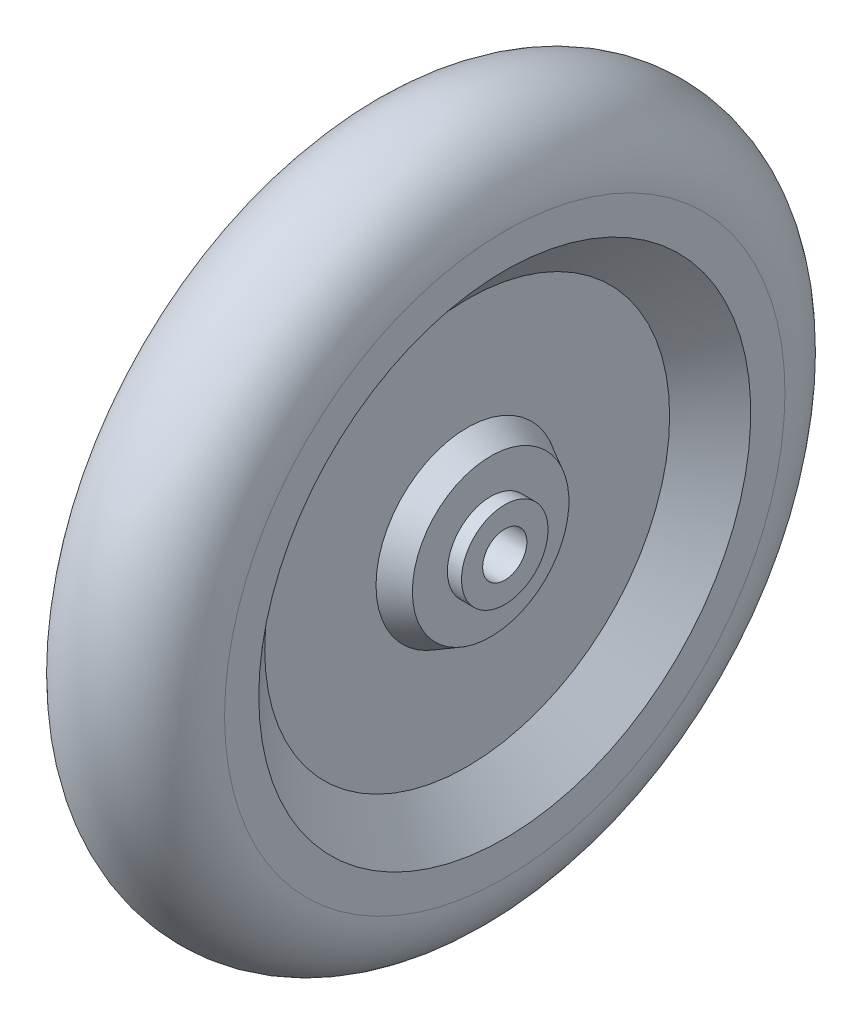
ISO-10303-21;
HEADER;
FILE_DESCRIPTION(('STEP AP214'),'2;1');
FILE_NAME('part.step','',(''),(''),'','','');
FILE_SCHEMA(('AUTOMOTIVE_DESIGN { 1 0 10303 214 1 1 1 1 }'));
ENDSEC;
DATA;
#1=APPLICATION_CONTEXT('core data for automotive mechanical design processes');
#2=APPLICATION_PROTOCOL_DEFINITION('international standard','automotive_design',2000,#1);
#3=PRODUCT_CONTEXT('',#1,'mechanical');
#4=PRODUCT('Part','Part','',(#3));
#5=PRODUCT_RELATED_PRODUCT_CATEGORY('part','',(#4));
#6=PRODUCT_DEFINITION_FORMATION('','',#4);
#7=PRODUCT_DEFINITION_CONTEXT('part definition',#1,'design');
#8=PRODUCT_DEFINITION('design','',#6,#7);
#9=PRODUCT_DEFINITION_SHAPE('','',#8);
#10=(LENGTH_UNIT() NAMED_UNIT(*) SI_UNIT(.MILLI.,.METRE.));
#11=(NAMED_UNIT(*) PLANE_ANGLE_UNIT() SI_UNIT($,.RADIAN.));
#12=(NAMED_UNIT(*) SI_UNIT($,.STERADIAN.) SOLID_ANGLE_UNIT());
#13=UNCERTAINTY_MEASURE_WITH_UNIT(LENGTH_MEASURE(1.E-05),#10,'distance_accuracy_value','');
#14=(GEOMETRIC_REPRESENTATION_CONTEXT(3) GLOBAL_UNCERTAINTY_ASSIGNED_CONTEXT((#13)) GLOBAL_UNIT_ASSIGNED_CONTEXT((#10,
#11,#12)) REPRESENTATION_CONTEXT('',''));
#15=CARTESIAN_POINT('',(0.,0.,0.));
#16=DIRECTION('',(0.,0.,1.));
#17=DIRECTION('',(1.,0.,0.));
#18=AXIS2_PLACEMENT_3D('',#15,#16,#17);
#19=CARTESIAN_POINT('',(-15.875,4.7625,0.));
#20=DIRECTION('',(1.,0.,0.));
#21=DIRECTION('',(0.,0.,-1.));
#22=AXIS2_PLACEMENT_3D('',#19,#20,#21);
#23=PLANE('',#22);
#24=CARTESIAN_POINT('',(-15.875,0.,0.));
#25=DIRECTION('',(-1.,0.,0.));
#26=DIRECTION('',(0.,0.,1.));
#27=AXIS2_PLACEMENT_3D('',#24,#25,#26);
#28=CIRCLE('',#27,4.7625);
#29=CARTESIAN_POINT('',(-15.875,0.,4.7625));
#30=VERTEX_POINT('',#29);
#31=EDGE_CURVE('E10',#30,#30,#28,.T.);
#32=ORIENTED_EDGE('',*,*,#31,.F.);
#33=EDGE_LOOP('',(#32));
#34=FACE_BOUND('',#33,.T.);
#35=CARTESIAN_POINT('',(-15.8750000000001,0.,0.));
#36=DIRECTION('',(-1.,0.,0.));
#37=DIRECTION('',(0.,0.,1.));
#38=AXIS2_PLACEMENT_3D('',#35,#36,#37);
#39=CIRCLE('',#38,9.31101513051158);
#40=CARTESIAN_POINT('',(-15.8750000000001,0.,9.31101513051158));
#41=VERTEX_POINT('',#40);
#42=EDGE_CURVE('E83',#41,#41,#39,.T.);
#43=ORIENTED_EDGE('',*,*,#42,.T.);
#44=EDGE_LOOP('',(#43));
#45=FACE_BOUND('',#44,.T.);
#46=ADVANCED_FACE('F31',(#34,#45),#23,.F.);
#47=CARTESIAN_POINT('',(-1000.,0.,0.));
#48=DIRECTION('',(-1.,0.,0.));
#49=DIRECTION('',(0.,0.,1.));
#50=AXIS2_PLACEMENT_3D('',#47,#48,#49);
#51=CYLINDRICAL_SURFACE('',#50,4.7625);
#52=CARTESIAN_POINT('',(15.8750000000001,0.,0.));
#53=DIRECTION('',(-1.,0.,0.));
#54=DIRECTION('',(0.,0.,1.));
#55=AXIS2_PLACEMENT_3D('',#52,#53,#54);
#56=CIRCLE('',#55,4.7625);
#57=CARTESIAN_POINT('',(15.8750000000001,0.,4.7625));
#58=VERTEX_POINT('',#57);
#59=EDGE_CURVE('E37',#58,#58,#56,.T.);
#60=ORIENTED_EDGE('',*,*,#59,.F.);
#61=EDGE_LOOP('',(#60));
#62=FACE_BOUND('',#61,.T.);
#63=ORIENTED_EDGE('',*,*,#31,.T.);
#64=EDGE_LOOP('',(#63));
#65=FACE_BOUND('',#64,.T.);
#66=ADVANCED_FACE('F168',(#62,#65),#51,.F.);
#67=CARTESIAN_POINT('',(15.875,4.7625,0.));
#68=DIRECTION('',(-1.,0.,0.));
#69=DIRECTION('',(0.,0.,1.));
#70=AXIS2_PLACEMENT_3D('',#67,#68,#69);
#71=PLANE('',#70);
#72=CARTESIAN_POINT('',(15.8750000000001,0.,0.));
#73=DIRECTION('',(-1.,0.,0.));
#74=DIRECTION('',(0.,0.,1.));
#75=AXIS2_PLACEMENT_3D('',#72,#73,#74);
#76=CIRCLE('',#75,9.31101513051158);
#77=CARTESIAN_POINT('',(15.8750000000001,0.,9.31101513051158));
#78=VERTEX_POINT('',#77);
#79=EDGE_CURVE('E41',#78,#78,#76,.T.);
#80=ORIENTED_EDGE('',*,*,#79,.F.);
#81=EDGE_LOOP('',(#80));
#82=FACE_BOUND('',#81,.T.);
#83=ORIENTED_EDGE('',*,*,#59,.T.);
#84=EDGE_LOOP('',(#83));
#85=FACE_BOUND('',#84,.T.);
#86=ADVANCED_FACE('F163',(#82,#85),#71,.F.);
#87=CARTESIAN_POINT('',(-1000.,0.,0.));
#88=DIRECTION('',(-1.,0.,0.));
#89=DIRECTION('',(0.,0.,1.));
#90=AXIS2_PLACEMENT_3D('',#87,#88,#89);
#91=CYLINDRICAL_SURFACE('',#90,9.31101513051158);
#92=CARTESIAN_POINT('',(12.8385031899303,0.,0.));
#93=DIRECTION('',(-1.,0.,0.));
#94=DIRECTION('',(0.,0.,1.));
#95=AXIS2_PLACEMENT_3D('',#92,#93,#94);
#96=CIRCLE('',#95,9.31101513051158);
#97=CARTESIAN_POINT('',(12.8385031899303,0.,9.31101513051158));
#98=VERTEX_POINT('',#97);
#99=EDGE_CURVE('E45',#98,#98,#96,.T.);
#100=ORIENTED_EDGE('',*,*,#99,.F.);
#101=EDGE_LOOP('',(#100));
#102=FACE_BOUND('',#101,.T.);
#103=ORIENTED_EDGE('',*,*,#79,.T.);
#104=EDGE_LOOP('',(#103));
#105=FACE_BOUND('',#104,.T.);
#106=ADVANCED_FACE('F157',(#102,#105),#91,.T.);
#107=CARTESIAN_POINT('',(12.8385031899302,9.31101513051158,0.));
#108=DIRECTION('',(-1.,0.,0.));
#109=DIRECTION('',(0.,0.,1.));
#110=AXIS2_PLACEMENT_3D('',#107,#108,#109);
#111=PLANE('',#110);
#112=CARTESIAN_POINT('',(12.8385031899303,0.,0.));
#113=DIRECTION('',(-1.,0.,0.));
#114=DIRECTION('',(0.,0.,1.));
#115=AXIS2_PLACEMENT_3D('',#112,#113,#114);
#116=CIRCLE('',#115,16.8508865092168);
#117=CARTESIAN_POINT('',(12.8385031899303,0.,16.8508865092168));
#118=VERTEX_POINT('',#117);
#119=EDGE_CURVE('E50',#118,#118,#116,.T.);
#120=ORIENTED_EDGE('',*,*,#119,.F.);
#121=EDGE_LOOP('',(#120));
#122=FACE_BOUND('',#121,.T.);
#123=ORIENTED_EDGE('',*,*,#99,.T.);
#124=EDGE_LOOP('',(#123));
#125=FACE_BOUND('',#124,.T.);
#126=ADVANCED_FACE('F151',(#122,#125),#111,.F.);
#127=CARTESIAN_POINT('',(12.8385031899303,0.,0.));
#128=DIRECTION('',(-1.,0.,0.));
#129=DIRECTION('',(0.,0.,1.));
#130=AXIS2_PLACEMENT_3D('',#127,#128,#129);
#131=CONICAL_SURFACE('',#130,16.8508865092168,0.501604054189691);
#132=CARTESIAN_POINT('',(7.78208729760599,0.,0.));
#133=DIRECTION('',(-1.,0.,0.));
#134=DIRECTION('',(0.,0.,1.));
#135=AXIS2_PLACEMENT_3D('',#132,#133,#134);
#136=CIRCLE('',#135,19.6237597404952);
#137=CARTESIAN_POINT('',(7.78208729760599,0.,19.6237597404952));
#138=VERTEX_POINT('',#137);
#139=EDGE_CURVE('E53',#138,#138,#136,.T.);
#140=ORIENTED_EDGE('',*,*,#139,.F.);
#141=EDGE_LOOP('',(#140));
#142=FACE_BOUND('',#141,.T.);
#143=ORIENTED_EDGE('',*,*,#119,.T.);
#144=EDGE_LOOP('',(#143));
#145=FACE_BOUND('',#144,.T.);
#146=ADVANCED_FACE('F145',(#142,#145),#131,.T.);
#147=CARTESIAN_POINT('',(7.78208729760609,43.5871976270477,0.));
#148=DIRECTION('',(-1.,0.,0.));
#149=DIRECTION('',(0.,0.,1.));
#150=AXIS2_PLACEMENT_3D('',#147,#148,#149);
#151=PLANE('',#150);
#152=CARTESIAN_POINT('',(7.78208729760599,0.,0.));
#153=DIRECTION('',(-1.,0.,0.));
#154=DIRECTION('',(0.,0.,1.));
#155=AXIS2_PLACEMENT_3D('',#152,#153,#154);
#156=CIRCLE('',#155,43.5871976270477);
#157=CARTESIAN_POINT('',(7.78208729760599,0.,43.5871976270477));
#158=VERTEX_POINT('',#157);
#159=EDGE_CURVE('E56',#158,#158,#156,.T.);
#160=ORIENTED_EDGE('',*,*,#159,.F.);
#161=EDGE_LOOP('',(#160));
#162=FACE_BOUND('',#161,.T.);
#163=ORIENTED_EDGE('',*,*,#139,.T.);
#164=EDGE_LOOP('',(#163));
#165=FACE_BOUND('',#164,.T.);
#166=ADVANCED_FACE('F139',(#162,#165),#151,.F.);
#167=CARTESIAN_POINT('',(7.78208729760599,0.,0.));
#168=DIRECTION('',(1.,0.,0.));
#169=DIRECTION('',(0.,0.,-1.));
#170=AXIS2_PLACEMENT_3D('',#167,#168,#169);
#171=CONICAL_SURFACE('',#170,43.5871976270477,0.858552168985071);
#172=CARTESIAN_POINT('',(15.875000000007,0.,0.));
#173=DIRECTION('',(-1.,0.,0.));
#174=DIRECTION('',(0.,0.,1.));
#175=AXIS2_PLACEMENT_3D('',#172,#173,#174);
#176=CIRCLE('',#175,52.9600878602281);
#177=CARTESIAN_POINT('',(15.875000000007,0.,52.9600878602281));
#178=VERTEX_POINT('',#177);
#179=EDGE_CURVE('E59',#178,#178,#176,.T.);
#180=ORIENTED_EDGE('',*,*,#179,.F.);
#181=EDGE_LOOP('',(#180));
#182=FACE_BOUND('',#181,.T.);
#183=ORIENTED_EDGE('',*,*,#159,.T.);
#184=EDGE_LOOP('',(#183));
#185=FACE_BOUND('',#184,.T.);
#186=ADVANCED_FACE('F133',(#182,#185),#171,.F.);
#187=CARTESIAN_POINT('',(15.8750000000035,52.9600878602281,0.));
#188=DIRECTION('',(-1.,0.,0.));
#189=DIRECTION('',(0.,0.,1.));
#190=AXIS2_PLACEMENT_3D('',#187,#188,#189);
#191=PLANE('',#190);
#192=CARTESIAN_POINT('',(15.8750000000001,0.,0.));
#193=DIRECTION('',(-1.,0.,0.));
#194=DIRECTION('',(0.,0.,1.));
#195=AXIS2_PLACEMENT_3D('',#192,#193,#194);
#196=CIRCLE('',#195,60.325);
#197=CARTESIAN_POINT('',(15.8750000000001,0.,60.325));
#198=VERTEX_POINT('',#197);
#199=EDGE_CURVE('E62',#198,#198,#196,.T.);
#200=ORIENTED_EDGE('',*,*,#199,.F.);
#201=EDGE_LOOP('',(#200));
#202=FACE_BOUND('',#201,.T.);
#203=ORIENTED_EDGE('',*,*,#179,.T.);
#204=EDGE_LOOP('',(#203));
#205=FACE_BOUND('',#204,.T.);
#206=ADVANCED_FACE('F127',(#202,#205),#191,.F.);
#207=CARTESIAN_POINT('',(0.,0.,0.));
#208=DIRECTION('',(-1.,0.,0.));
#209=DIRECTION('',(0.,0.,1.));
#210=AXIS2_PLACEMENT_3D('',#207,#208,#209);
#211=TOROIDAL_SURFACE('',#210,60.325,15.875);
#212=CARTESIAN_POINT('',(-15.875,0.,0.));
#213=DIRECTION('',(-1.,0.,0.));
#214=DIRECTION('',(0.,0.,1.));
#215=AXIS2_PLACEMENT_3D('',#212,#213,#214);
#216=CIRCLE('',#215,60.325);
#217=CARTESIAN_POINT('',(-15.875,0.,60.325));
#218=VERTEX_POINT('',#217);
#219=EDGE_CURVE('E65',#218,#218,#216,.T.);
#220=ORIENTED_EDGE('',*,*,#219,.F.);
#221=EDGE_LOOP('',(#220));
#222=FACE_BOUND('',#221,.T.);
#223=ORIENTED_EDGE('',*,*,#199,.T.);
#224=EDGE_LOOP('',(#223));
#225=FACE_BOUND('',#224,.T.);
#226=ADVANCED_FACE('F121',(#222,#225),#211,.T.);
#227=CARTESIAN_POINT('',(-15.875,52.9600878602281,0.));
#228=DIRECTION('',(1.,0.,0.));
#229=DIRECTION('',(0.,0.,-1.));
#230=AXIS2_PLACEMENT_3D('',#227,#228,#229);
#231=PLANE('',#230);
#232=CARTESIAN_POINT('',(-15.875,0.,0.));
#233=DIRECTION('',(-1.,0.,0.));
#234=DIRECTION('',(0.,0.,1.));
#235=AXIS2_PLACEMENT_3D('',#232,#233,#234);
#236=CIRCLE('',#235,52.9600878602281);
#237=CARTESIAN_POINT('',(-15.875,0.,52.9600878602281));
#238=VERTEX_POINT('',#237);
#239=EDGE_CURVE('E68',#238,#238,#236,.T.);
#240=ORIENTED_EDGE('',*,*,#239,.F.);
#241=EDGE_LOOP('',(#240));
#242=FACE_BOUND('',#241,.T.);
#243=ORIENTED_EDGE('',*,*,#219,.T.);
#244=EDGE_LOOP('',(#243));
#245=FACE_BOUND('',#244,.T.);
#246=ADVANCED_FACE('F115',(#242,#245),#231,.F.);
#247=CARTESIAN_POINT('',(-15.875,0.,0.));
#248=DIRECTION('',(-1.,0.,0.));
#249=DIRECTION('',(0.,0.,1.));
#250=AXIS2_PLACEMENT_3D('',#247,#248,#249);
#251=CONICAL_SURFACE('',#250,52.9600878602281,0.858552168985078);
#252=CARTESIAN_POINT('',(-7.78208729759911,0.,0.));
#253=DIRECTION('',(-1.,0.,0.));
#254=DIRECTION('',(0.,0.,1.));
#255=AXIS2_PLACEMENT_3D('',#252,#253,#254);
#256=CIRCLE('',#255,43.5871976270477);
#257=CARTESIAN_POINT('',(-7.78208729759911,0.,43.5871976270477));
#258=VERTEX_POINT('',#257);
#259=EDGE_CURVE('E71',#258,#258,#256,.T.);
#260=ORIENTED_EDGE('',*,*,#259,.F.);
#261=EDGE_LOOP('',(#260));
#262=FACE_BOUND('',#261,.T.);
#263=ORIENTED_EDGE('',*,*,#239,.T.);
#264=EDGE_LOOP('',(#263));
#265=FACE_BOUND('',#264,.T.);
#266=ADVANCED_FACE('F109',(#262,#265),#251,.F.);
#267=CARTESIAN_POINT('',(-7.78208729759911,43.5871976270477,0.));
#268=DIRECTION('',(1.,0.,0.));
#269=DIRECTION('',(0.,0.,-1.));
#270=AXIS2_PLACEMENT_3D('',#267,#268,#269);
#271=PLANE('',#270);
#272=CARTESIAN_POINT('',(-7.78208729759911,0.,0.));
#273=DIRECTION('',(-1.,0.,0.));
#274=DIRECTION('',(0.,0.,1.));
#275=AXIS2_PLACEMENT_3D('',#272,#273,#274);
#276=CIRCLE('',#275,19.6237597404952);
#277=CARTESIAN_POINT('',(-7.78208729759911,0.,19.6237597404952));
#278=VERTEX_POINT('',#277);
#279=EDGE_CURVE('E74',#278,#278,#276,.T.);
#280=ORIENTED_EDGE('',*,*,#279,.F.);
#281=EDGE_LOOP('',(#280));
#282=FACE_BOUND('',#281,.T.);
#283=ORIENTED_EDGE('',*,*,#259,.T.);
#284=EDGE_LOOP('',(#283));
#285=FACE_BOUND('',#284,.T.);
#286=ADVANCED_FACE('F103',(#282,#285),#271,.F.);
#287=CARTESIAN_POINT('',(-7.78208729759911,0.,0.));
#288=DIRECTION('',(1.,0.,0.));
#289=DIRECTION('',(0.,0.,-1.));
#290=AXIS2_PLACEMENT_3D('',#287,#288,#289);
#291=CONICAL_SURFACE('',#290,19.6237597404952,0.501604054189126);
#292=CARTESIAN_POINT('',(-12.8385031899302,0.,0.));
#293=DIRECTION('',(-1.,0.,0.));
#294=DIRECTION('',(0.,0.,1.));
#295=AXIS2_PLACEMENT_3D('',#292,#293,#294);
#296=CIRCLE('',#295,16.8508865092168);
#297=CARTESIAN_POINT('',(-12.8385031899302,0.,16.8508865092168));
#298=VERTEX_POINT('',#297);
#299=EDGE_CURVE('E77',#298,#298,#296,.T.);
#300=ORIENTED_EDGE('',*,*,#299,.F.);
#301=EDGE_LOOP('',(#300));
#302=FACE_BOUND('',#301,.T.);
#303=ORIENTED_EDGE('',*,*,#279,.T.);
#304=EDGE_LOOP('',(#303));
#305=FACE_BOUND('',#304,.T.);
#306=ADVANCED_FACE('F97',(#302,#305),#291,.T.);
#307=CARTESIAN_POINT('',(-12.8385031899302,9.31101513051158,0.));
#308=DIRECTION('',(1.,0.,0.));
#309=DIRECTION('',(0.,0.,-1.));
#310=AXIS2_PLACEMENT_3D('',#307,#308,#309);
#311=PLANE('',#310);
#312=CARTESIAN_POINT('',(-12.8385031899302,0.,0.));
#313=DIRECTION('',(-1.,0.,0.));
#314=DIRECTION('',(0.,0.,1.));
#315=AXIS2_PLACEMENT_3D('',#312,#313,#314);
#316=CIRCLE('',#315,9.31101513051158);
#317=CARTESIAN_POINT('',(-12.8385031899302,0.,9.31101513051158));
#318=VERTEX_POINT('',#317);
#319=EDGE_CURVE('E80',#318,#318,#316,.T.);
#320=ORIENTED_EDGE('',*,*,#319,.F.);
#321=EDGE_LOOP('',(#320));
#322=FACE_BOUND('',#321,.T.);
#323=ORIENTED_EDGE('',*,*,#299,.T.);
#324=EDGE_LOOP('',(#323));
#325=FACE_BOUND('',#324,.T.);
#326=ADVANCED_FACE('F91',(#322,#325),#311,.F.);
#327=CARTESIAN_POINT('',(-1000.,0.,0.));
#328=DIRECTION('',(-1.,0.,0.));
#329=DIRECTION('',(0.,0.,1.));
#330=AXIS2_PLACEMENT_3D('',#327,#328,#329);
#331=CYLINDRICAL_SURFACE('',#330,9.31101513051158);
#332=ORIENTED_EDGE('',*,*,#42,.F.);
#333=EDGE_LOOP('',(#332));
#334=FACE_BOUND('',#333,.T.);
#335=ORIENTED_EDGE('',*,*,#319,.T.);
#336=EDGE_LOOP('',(#335));
#337=FACE_BOUND('',#336,.T.);
#338=ADVANCED_FACE('F88',(#334,#337),#331,.T.);
#339=CLOSED_SHELL('',(#46,#66,#86,#106,#126,#146,#166,#186,#206,#226,#246,#266,#286,#306,#326,#338));
#340=MANIFOLD_SOLID_BREP('B2',#339);
#341=ADVANCED_BREP_SHAPE_REPRESENTATION('',(#18,#340),#14);
#342=SHAPE_DEFINITION_REPRESENTATION(#9,#341);
ENDSEC;
END-ISO-10303-21;
